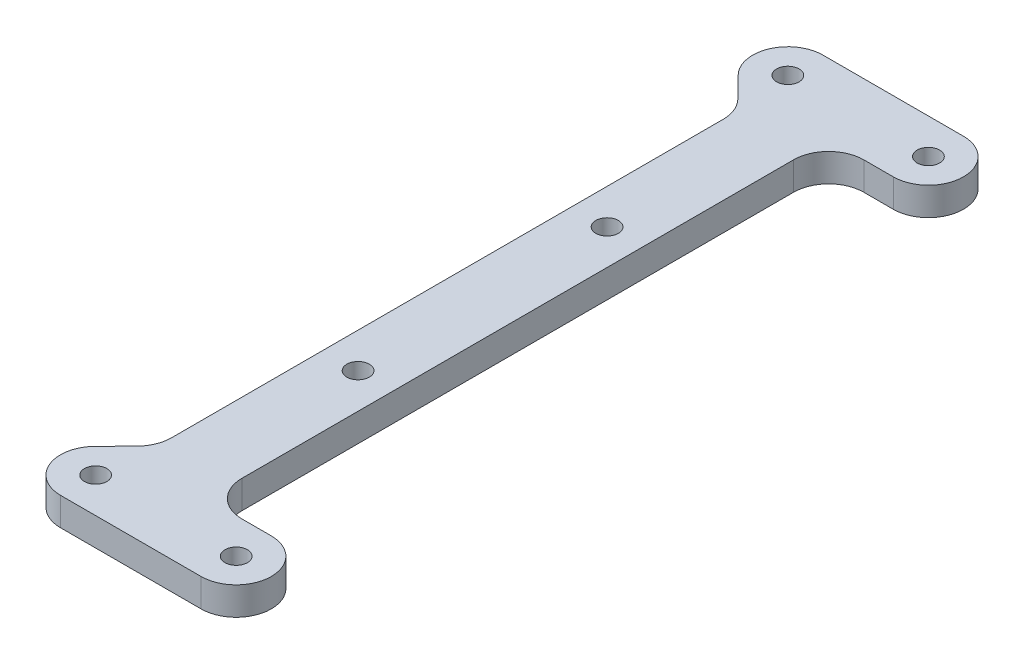
ISO-10303-21;
HEADER;
FILE_DESCRIPTION(('STEP AP214'),'2;1');
FILE_NAME('part.step','',(''),(''),'','','');
FILE_SCHEMA(('AUTOMOTIVE_DESIGN { 1 0 10303 214 1 1 1 1 }'));
ENDSEC;
DATA;
#1=APPLICATION_CONTEXT('core data for automotive mechanical design processes');
#2=APPLICATION_PROTOCOL_DEFINITION('international standard','automotive_design',2000,#1);
#3=PRODUCT_CONTEXT('',#1,'mechanical');
#4=PRODUCT('Part','Part','',(#3));
#5=PRODUCT_RELATED_PRODUCT_CATEGORY('part','',(#4));
#6=PRODUCT_DEFINITION_FORMATION('','',#4);
#7=PRODUCT_DEFINITION_CONTEXT('part definition',#1,'design');
#8=PRODUCT_DEFINITION('design','',#6,#7);
#9=PRODUCT_DEFINITION_SHAPE('','',#8);
#10=(LENGTH_UNIT() NAMED_UNIT(*) SI_UNIT(.MILLI.,.METRE.));
#11=(NAMED_UNIT(*) PLANE_ANGLE_UNIT() SI_UNIT($,.RADIAN.));
#12=(NAMED_UNIT(*) SI_UNIT($,.STERADIAN.) SOLID_ANGLE_UNIT());
#13=UNCERTAINTY_MEASURE_WITH_UNIT(LENGTH_MEASURE(1.E-05),#10,'distance_accuracy_value','');
#14=(GEOMETRIC_REPRESENTATION_CONTEXT(3) GLOBAL_UNCERTAINTY_ASSIGNED_CONTEXT((#13)) GLOBAL_UNIT_ASSIGNED_CONTEXT((#10,
#11,#12)) REPRESENTATION_CONTEXT('',''));
#15=CARTESIAN_POINT('',(0.,0.,0.));
#16=DIRECTION('',(0.,0.,1.));
#17=DIRECTION('',(1.,0.,0.));
#18=AXIS2_PLACEMENT_3D('',#15,#16,#17);
#19=CARTESIAN_POINT('',(5.80999999999996,4.,-39.25));
#20=DIRECTION('',(0.,-1.,0.));
#21=DIRECTION('',(0.,0.,-1.));
#22=AXIS2_PLACEMENT_3D('',#19,#20,#21);
#23=CYLINDRICAL_SURFACE('',#22,5.00000000000001);
#24=CARTESIAN_POINT('',(5.80999999999996,0.,-39.25));
#25=DIRECTION('',(0.,1.,0.));
#26=DIRECTION('',(0.,0.,1.));
#27=AXIS2_PLACEMENT_3D('',#24,#25,#26);
#28=CIRCLE('',#27,5.00000000000001);
#29=CARTESIAN_POINT('',(0.809999999999957,0.,-39.25));
#30=VERTEX_POINT('',#29);
#31=CARTESIAN_POINT('',(5.80999999999996,0.,-44.25));
#32=VERTEX_POINT('',#31);
#33=EDGE_CURVE('E198',#30,#32,#28,.F.);
#34=ORIENTED_EDGE('',*,*,#33,.T.);
#35=DIRECTION('',(0.,-1.,0.));
#36=VECTOR('',#35,1.);
#37=CARTESIAN_POINT('',(5.80999999999996,4.,-44.25));
#38=LINE('',#37,#36);
#39=CARTESIAN_POINT('',(5.80999999999996,4.,-44.25));
#40=VERTEX_POINT('',#39);
#41=EDGE_CURVE('E11',#40,#32,#38,.T.);
#42=ORIENTED_EDGE('',*,*,#41,.F.);
#43=CARTESIAN_POINT('',(5.80999999999996,4.,-39.25));
#44=DIRECTION('',(0.,1.,0.));
#45=DIRECTION('',(0.,0.,1.));
#46=AXIS2_PLACEMENT_3D('',#43,#44,#45);
#47=CIRCLE('',#46,5.00000000000001);
#48=CARTESIAN_POINT('',(0.809999999999957,4.,-39.25));
#49=VERTEX_POINT('',#48);
#50=EDGE_CURVE('E257',#49,#40,#47,.F.);
#51=ORIENTED_EDGE('',*,*,#50,.F.);
#52=DIRECTION('',(0.,-1.,0.));
#53=VECTOR('',#52,1.);
#54=CARTESIAN_POINT('',(0.809999999999957,4.,-39.25));
#55=LINE('',#54,#53);
#56=EDGE_CURVE('E51',#49,#30,#55,.T.);
#57=ORIENTED_EDGE('',*,*,#56,.T.);
#58=EDGE_LOOP('',(#34,#42,#51,#57));
#59=FACE_BOUND('',#58,.T.);
#60=ADVANCED_FACE('F35',(#59),#23,.F.);
#61=CARTESIAN_POINT('',(0.,4.,-44.25));
#62=DIRECTION('',(0.,0.,-1.));
#63=DIRECTION('',(-1.,0.,0.));
#64=AXIS2_PLACEMENT_3D('',#61,#62,#63);
#65=PLANE('',#64);
#66=DIRECTION('',(1.,0.,0.));
#67=VECTOR('',#66,1.);
#68=CARTESIAN_POINT('',(0.,0.,-44.25));
#69=LINE('',#68,#67);
#70=CARTESIAN_POINT('',(9.99999999999996,0.,-44.25));
#71=VERTEX_POINT('',#70);
#72=EDGE_CURVE('E200',#32,#71,#69,.T.);
#73=ORIENTED_EDGE('',*,*,#72,.T.);
#74=DIRECTION('',(0.,-1.,0.));
#75=VECTOR('',#74,1.);
#76=CARTESIAN_POINT('',(9.99999999999996,4.,-44.25));
#77=LINE('',#76,#75);
#78=CARTESIAN_POINT('',(9.99999999999996,4.,-44.25));
#79=VERTEX_POINT('',#78);
#80=EDGE_CURVE('E43',#79,#71,#77,.T.);
#81=ORIENTED_EDGE('',*,*,#80,.F.);
#82=DIRECTION('',(1.,0.,0.));
#83=VECTOR('',#82,1.);
#84=CARTESIAN_POINT('',(0.,4.,-44.25));
#85=LINE('',#84,#83);
#86=EDGE_CURVE('E113',#40,#79,#85,.T.);
#87=ORIENTED_EDGE('',*,*,#86,.F.);
#88=ORIENTED_EDGE('',*,*,#41,.T.);
#89=EDGE_LOOP('',(#73,#81,#87,#88));
#90=FACE_BOUND('',#89,.T.);
#91=ADVANCED_FACE('F343',(#90),#65,.F.);
#92=CARTESIAN_POINT('',(10.,4.,-49.25));
#93=DIRECTION('',(0.,-1.,0.));
#94=DIRECTION('',(0.,0.,-1.));
#95=AXIS2_PLACEMENT_3D('',#92,#93,#94);
#96=CYLINDRICAL_SURFACE('',#95,5.);
#97=CARTESIAN_POINT('',(10.,0.,-49.25));
#98=DIRECTION('',(0.,1.,0.));
#99=DIRECTION('',(0.,0.,1.));
#100=AXIS2_PLACEMENT_3D('',#97,#98,#99);
#101=CIRCLE('',#100,5.);
#102=CARTESIAN_POINT('',(9.99999999999999,0.,-54.25));
#103=VERTEX_POINT('',#102);
#104=EDGE_CURVE('E202',#71,#103,#101,.T.);
#105=ORIENTED_EDGE('',*,*,#104,.T.);
#106=DIRECTION('',(0.,-1.,0.));
#107=VECTOR('',#106,1.);
#108=CARTESIAN_POINT('',(9.99999999999999,4.,-54.25));
#109=LINE('',#108,#107);
#110=CARTESIAN_POINT('',(9.99999999999999,4.,-54.25));
#111=VERTEX_POINT('',#110);
#112=EDGE_CURVE('E281',#111,#103,#109,.T.);
#113=ORIENTED_EDGE('',*,*,#112,.F.);
#114=CARTESIAN_POINT('',(10.,4.,-49.25));
#115=DIRECTION('',(0.,1.,0.));
#116=DIRECTION('',(0.,0.,1.));
#117=AXIS2_PLACEMENT_3D('',#114,#115,#116);
#118=CIRCLE('',#117,5.);
#119=EDGE_CURVE('E288',#79,#111,#118,.T.);
#120=ORIENTED_EDGE('',*,*,#119,.F.);
#121=ORIENTED_EDGE('',*,*,#80,.T.);
#122=EDGE_LOOP('',(#105,#113,#120,#121));
#123=FACE_BOUND('',#122,.T.);
#124=ADVANCED_FACE('F286',(#123),#96,.T.);
#125=CARTESIAN_POINT('',(0.,4.,-54.25));
#126=DIRECTION('',(0.,0.,-1.));
#127=DIRECTION('',(-1.,0.,0.));
#128=AXIS2_PLACEMENT_3D('',#125,#126,#127);
#129=PLANE('',#128);
#130=DIRECTION('',(1.,0.,0.));
#131=VECTOR('',#130,1.);
#132=CARTESIAN_POINT('',(0.,0.,-54.25));
#133=LINE('',#132,#131);
#134=CARTESIAN_POINT('',(-9.99999999999999,0.,-54.25));
#135=VERTEX_POINT('',#134);
#136=EDGE_CURVE('E205',#135,#103,#133,.T.);
#137=ORIENTED_EDGE('',*,*,#136,.F.);
#138=DIRECTION('',(0.,-1.,0.));
#139=VECTOR('',#138,1.);
#140=CARTESIAN_POINT('',(-9.99999999999999,4.,-54.25));
#141=LINE('',#140,#139);
#142=CARTESIAN_POINT('',(-9.99999999999999,4.,-54.25));
#143=VERTEX_POINT('',#142);
#144=EDGE_CURVE('E279',#143,#135,#141,.T.);
#145=ORIENTED_EDGE('',*,*,#144,.F.);
#146=DIRECTION('',(1.,0.,0.));
#147=VECTOR('',#146,1.);
#148=CARTESIAN_POINT('',(0.,4.,-54.25));
#149=LINE('',#148,#147);
#150=EDGE_CURVE('E299',#143,#111,#149,.T.);
#151=ORIENTED_EDGE('',*,*,#150,.T.);
#152=ORIENTED_EDGE('',*,*,#112,.T.);
#153=EDGE_LOOP('',(#137,#145,#151,#152));
#154=FACE_BOUND('',#153,.T.);
#155=ADVANCED_FACE('F295',(#154),#129,.T.);
#156=CARTESIAN_POINT('',(-9.99999999999998,4.,-49.25));
#157=DIRECTION('',(0.,-1.,0.));
#158=DIRECTION('',(0.,0.,-1.));
#159=AXIS2_PLACEMENT_3D('',#156,#157,#158);
#160=CYLINDRICAL_SURFACE('',#159,5.);
#161=CARTESIAN_POINT('',(-9.99999999999998,0.,-49.25));
#162=DIRECTION('',(0.,1.,0.));
#163=DIRECTION('',(0.,0.,1.));
#164=AXIS2_PLACEMENT_3D('',#161,#162,#163);
#165=CIRCLE('',#164,5.);
#166=CARTESIAN_POINT('',(-13.5642557042978,0.,-45.7434231401008));
#167=VERTEX_POINT('',#166);
#168=EDGE_CURVE('E208',#135,#167,#165,.T.);
#169=ORIENTED_EDGE('',*,*,#168,.T.);
#170=DIRECTION('',(0.,-1.,0.));
#171=VECTOR('',#170,1.);
#172=CARTESIAN_POINT('',(-13.5642557042978,4.,-45.7434231401008));
#173=LINE('',#172,#171);
#174=CARTESIAN_POINT('',(-13.5642557042978,4.,-45.7434231401008));
#175=VERTEX_POINT('',#174);
#176=EDGE_CURVE('E277',#175,#167,#173,.T.);
#177=ORIENTED_EDGE('',*,*,#176,.F.);
#178=CARTESIAN_POINT('',(-9.99999999999998,4.,-49.25));
#179=DIRECTION('',(0.,1.,0.));
#180=DIRECTION('',(0.,0.,1.));
#181=AXIS2_PLACEMENT_3D('',#178,#179,#180);
#182=CIRCLE('',#181,5.);
#183=EDGE_CURVE('E300',#143,#175,#182,.T.);
#184=ORIENTED_EDGE('',*,*,#183,.F.);
#185=ORIENTED_EDGE('',*,*,#144,.T.);
#186=EDGE_LOOP('',(#169,#177,#184,#185));
#187=FACE_BOUND('',#186,.T.);
#188=ADVANCED_FACE('F356',(#187),#160,.T.);
#189=CARTESIAN_POINT('',(15.9758998590997,4.,-15.7173686204488));
#190=DIRECTION('',(-0.712851140859559,0.,0.701315371979843));
#191=DIRECTION('',(0.701315371979843,0.,0.712851140859559));
#192=AXIS2_PLACEMENT_3D('',#189,#190,#191);
#193=PLANE('',#192);
#194=DIRECTION('',(-0.701315371979843,0.,-0.712851140859559));
#195=VECTOR('',#194,1.);
#196=CARTESIAN_POINT('',(15.9758998590997,0.,-15.7173686204488));
#197=LINE('',#196,#195);
#198=CARTESIAN_POINT('',(-10.6257442957022,0.,-42.7565768598992));
#199=VERTEX_POINT('',#198);
#200=EDGE_CURVE('E211',#199,#167,#197,.T.);
#201=ORIENTED_EDGE('',*,*,#200,.F.);
#202=DIRECTION('',(0.,-1.,0.));
#203=VECTOR('',#202,1.);
#204=CARTESIAN_POINT('',(-10.6257442957022,4.,-42.7565768598992));
#205=LINE('',#204,#203);
#206=CARTESIAN_POINT('',(-10.6257442957022,4.,-42.7565768598992));
#207=VERTEX_POINT('',#206);
#208=EDGE_CURVE('E275',#207,#199,#205,.T.);
#209=ORIENTED_EDGE('',*,*,#208,.F.);
#210=DIRECTION('',(-0.701315371979843,0.,-0.712851140859559));
#211=VECTOR('',#210,1.);
#212=CARTESIAN_POINT('',(15.9758998590997,4.,-15.7173686204488));
#213=LINE('',#212,#211);
#214=EDGE_CURVE('E302',#207,#175,#213,.T.);
#215=ORIENTED_EDGE('',*,*,#214,.T.);
#216=ORIENTED_EDGE('',*,*,#176,.T.);
#217=EDGE_LOOP('',(#201,#209,#215,#216));
#218=FACE_BOUND('',#217,.T.);
#219=ADVANCED_FACE('F359',(#218),#193,.T.);
#220=CARTESIAN_POINT('',(-14.19,4.,-39.25));
#221=DIRECTION('',(0.,-1.,0.));
#222=DIRECTION('',(0.,0.,-1.));
#223=AXIS2_PLACEMENT_3D('',#220,#221,#222);
#224=CYLINDRICAL_SURFACE('',#223,5.);
#225=CARTESIAN_POINT('',(-14.19,0.,-39.25));
#226=DIRECTION('',(0.,1.,0.));
#227=DIRECTION('',(0.,0.,1.));
#228=AXIS2_PLACEMENT_3D('',#225,#226,#227);
#229=CIRCLE('',#228,5.);
#230=CARTESIAN_POINT('',(-9.19000000000002,0.,-39.25));
#231=VERTEX_POINT('',#230);
#232=EDGE_CURVE('E214',#231,#199,#229,.T.);
#233=ORIENTED_EDGE('',*,*,#232,.F.);
#234=DIRECTION('',(0.,-1.,0.));
#235=VECTOR('',#234,1.);
#236=CARTESIAN_POINT('',(-9.19000000000002,4.,-39.25));
#237=LINE('',#236,#235);
#238=CARTESIAN_POINT('',(-9.19000000000002,4.,-39.25));
#239=VERTEX_POINT('',#238);
#240=EDGE_CURVE('E273',#239,#231,#237,.T.);
#241=ORIENTED_EDGE('',*,*,#240,.F.);
#242=CARTESIAN_POINT('',(-14.19,4.,-39.25));
#243=DIRECTION('',(0.,1.,0.));
#244=DIRECTION('',(0.,0.,1.));
#245=AXIS2_PLACEMENT_3D('',#242,#243,#244);
#246=CIRCLE('',#245,5.);
#247=EDGE_CURVE('E309',#239,#207,#246,.T.);
#248=ORIENTED_EDGE('',*,*,#247,.T.);
#249=ORIENTED_EDGE('',*,*,#208,.T.);
#250=EDGE_LOOP('',(#233,#241,#248,#249));
#251=FACE_BOUND('',#250,.T.);
#252=ADVANCED_FACE('F363',(#251),#224,.F.);
#253=CARTESIAN_POINT('',(-9.19000000000002,4.,0.));
#254=DIRECTION('',(1.,0.,0.));
#255=DIRECTION('',(0.,0.,-1.));
#256=AXIS2_PLACEMENT_3D('',#253,#254,#255);
#257=PLANE('',#256);
#258=DIRECTION('',(0.,0.,1.));
#259=VECTOR('',#258,1.);
#260=CARTESIAN_POINT('',(-9.19000000000002,0.,0.));
#261=LINE('',#260,#259);
#262=CARTESIAN_POINT('',(-9.19000000000002,0.,39.25));
#263=VERTEX_POINT('',#262);
#264=EDGE_CURVE('E217',#231,#263,#261,.T.);
#265=ORIENTED_EDGE('',*,*,#264,.T.);
#266=DIRECTION('',(0.,-1.,0.));
#267=VECTOR('',#266,1.);
#268=CARTESIAN_POINT('',(-9.19000000000002,4.,39.25));
#269=LINE('',#268,#267);
#270=CARTESIAN_POINT('',(-9.19000000000002,4.,39.25));
#271=VERTEX_POINT('',#270);
#272=EDGE_CURVE('E270',#271,#263,#269,.T.);
#273=ORIENTED_EDGE('',*,*,#272,.F.);
#274=DIRECTION('',(0.,0.,1.));
#275=VECTOR('',#274,1.);
#276=CARTESIAN_POINT('',(-9.19000000000002,4.,0.));
#277=LINE('',#276,#275);
#278=EDGE_CURVE('E312',#239,#271,#277,.T.);
#279=ORIENTED_EDGE('',*,*,#278,.F.);
#280=ORIENTED_EDGE('',*,*,#240,.T.);
#281=EDGE_LOOP('',(#265,#273,#279,#280));
#282=FACE_BOUND('',#281,.T.);
#283=ADVANCED_FACE('F367',(#282),#257,.F.);
#284=CARTESIAN_POINT('',(-14.19,4.,39.25));
#285=DIRECTION('',(0.,-1.,0.));
#286=DIRECTION('',(0.,0.,-1.));
#287=AXIS2_PLACEMENT_3D('',#284,#285,#286);
#288=CYLINDRICAL_SURFACE('',#287,5.);
#289=CARTESIAN_POINT('',(-14.19,0.,39.25));
#290=DIRECTION('',(0.,1.,0.));
#291=DIRECTION('',(0.,0.,1.));
#292=AXIS2_PLACEMENT_3D('',#289,#290,#291);
#293=CIRCLE('',#292,5.);
#294=CARTESIAN_POINT('',(-10.6257442957022,0.,42.7565768598992));
#295=VERTEX_POINT('',#294);
#296=EDGE_CURVE('E219',#263,#295,#293,.F.);
#297=ORIENTED_EDGE('',*,*,#296,.T.);
#298=DIRECTION('',(0.,-1.,0.));
#299=VECTOR('',#298,1.);
#300=CARTESIAN_POINT('',(-10.6257442957022,4.,42.7565768598992));
#301=LINE('',#300,#299);
#302=CARTESIAN_POINT('',(-10.6257442957022,4.,42.7565768598992));
#303=VERTEX_POINT('',#302);
#304=EDGE_CURVE('E267',#303,#295,#301,.T.);
#305=ORIENTED_EDGE('',*,*,#304,.F.);
#306=CARTESIAN_POINT('',(-14.19,4.,39.25));
#307=DIRECTION('',(0.,1.,0.));
#308=DIRECTION('',(0.,0.,1.));
#309=AXIS2_PLACEMENT_3D('',#306,#307,#308);
#310=CIRCLE('',#309,5.);
#311=EDGE_CURVE('E314',#271,#303,#310,.F.);
#312=ORIENTED_EDGE('',*,*,#311,.F.);
#313=ORIENTED_EDGE('',*,*,#272,.T.);
#314=EDGE_LOOP('',(#297,#305,#312,#313));
#315=FACE_BOUND('',#314,.T.);
#316=ADVANCED_FACE('F371',(#315),#288,.F.);
#317=CARTESIAN_POINT('',(15.9758998590997,4.,15.7173686204489));
#318=DIRECTION('',(0.712851140859558,0.,0.701315371979844));
#319=DIRECTION('',(0.701315371979844,0.,-0.712851140859558));
#320=AXIS2_PLACEMENT_3D('',#317,#318,#319);
#321=PLANE('',#320);
#322=DIRECTION('',(-0.701315371979844,0.,0.712851140859558));
#323=VECTOR('',#322,1.);
#324=CARTESIAN_POINT('',(15.9758998590997,0.,15.7173686204489));
#325=LINE('',#324,#323);
#326=CARTESIAN_POINT('',(-13.5642557042978,0.,45.7434231401008));
#327=VERTEX_POINT('',#326);
#328=EDGE_CURVE('E221',#295,#327,#325,.T.);
#329=ORIENTED_EDGE('',*,*,#328,.T.);
#330=DIRECTION('',(0.,-1.,0.));
#331=VECTOR('',#330,1.);
#332=CARTESIAN_POINT('',(-13.5642557042978,4.,45.7434231401008));
#333=LINE('',#332,#331);
#334=CARTESIAN_POINT('',(-13.5642557042978,4.,45.7434231401008));
#335=VERTEX_POINT('',#334);
#336=EDGE_CURVE('E265',#335,#327,#333,.T.);
#337=ORIENTED_EDGE('',*,*,#336,.F.);
#338=DIRECTION('',(-0.701315371979844,0.,0.712851140859558));
#339=VECTOR('',#338,1.);
#340=CARTESIAN_POINT('',(15.9758998590997,4.,15.7173686204489));
#341=LINE('',#340,#339);
#342=EDGE_CURVE('E316',#303,#335,#341,.T.);
#343=ORIENTED_EDGE('',*,*,#342,.F.);
#344=ORIENTED_EDGE('',*,*,#304,.T.);
#345=EDGE_LOOP('',(#329,#337,#343,#344));
#346=FACE_BOUND('',#345,.T.);
#347=ADVANCED_FACE('F375',(#346),#321,.F.);
#348=CARTESIAN_POINT('',(-9.99999999999998,4.,49.25));
#349=DIRECTION('',(0.,-1.,0.));
#350=DIRECTION('',(0.,0.,-1.));
#351=AXIS2_PLACEMENT_3D('',#348,#349,#350);
#352=CYLINDRICAL_SURFACE('',#351,5.);
#353=CARTESIAN_POINT('',(-9.99999999999998,0.,49.25));
#354=DIRECTION('',(0.,1.,0.));
#355=DIRECTION('',(0.,0.,1.));
#356=AXIS2_PLACEMENT_3D('',#353,#354,#355);
#357=CIRCLE('',#356,5.);
#358=CARTESIAN_POINT('',(-9.99999999999996,0.,54.25));
#359=VERTEX_POINT('',#358);
#360=EDGE_CURVE('E224',#359,#327,#357,.F.);
#361=ORIENTED_EDGE('',*,*,#360,.F.);
#362=DIRECTION('',(0.,-1.,0.));
#363=VECTOR('',#362,1.);
#364=CARTESIAN_POINT('',(-9.99999999999996,4.,54.25));
#365=LINE('',#364,#363);
#366=CARTESIAN_POINT('',(-9.99999999999996,4.,54.25));
#367=VERTEX_POINT('',#366);
#368=EDGE_CURVE('E263',#367,#359,#365,.T.);
#369=ORIENTED_EDGE('',*,*,#368,.F.);
#370=CARTESIAN_POINT('',(-9.99999999999998,4.,49.25));
#371=DIRECTION('',(0.,1.,0.));
#372=DIRECTION('',(0.,0.,1.));
#373=AXIS2_PLACEMENT_3D('',#370,#371,#372);
#374=CIRCLE('',#373,5.);
#375=EDGE_CURVE('E318',#367,#335,#374,.F.);
#376=ORIENTED_EDGE('',*,*,#375,.T.);
#377=ORIENTED_EDGE('',*,*,#336,.T.);
#378=EDGE_LOOP('',(#361,#369,#376,#377));
#379=FACE_BOUND('',#378,.T.);
#380=ADVANCED_FACE('F379',(#379),#352,.T.);
#381=CARTESIAN_POINT('',(0.,4.,54.25));
#382=DIRECTION('',(0.,0.,-1.));
#383=DIRECTION('',(-1.,0.,0.));
#384=AXIS2_PLACEMENT_3D('',#381,#382,#383);
#385=PLANE('',#384);
#386=DIRECTION('',(1.,0.,0.));
#387=VECTOR('',#386,1.);
#388=CARTESIAN_POINT('',(0.,0.,54.25));
#389=LINE('',#388,#387);
#390=CARTESIAN_POINT('',(9.99999999999999,0.,54.25));
#391=VERTEX_POINT('',#390);
#392=EDGE_CURVE('E227',#359,#391,#389,.T.);
#393=ORIENTED_EDGE('',*,*,#392,.T.);
#394=DIRECTION('',(0.,-1.,0.));
#395=VECTOR('',#394,1.);
#396=CARTESIAN_POINT('',(9.99999999999999,4.,54.25));
#397=LINE('',#396,#395);
#398=CARTESIAN_POINT('',(9.99999999999999,4.,54.25));
#399=VERTEX_POINT('',#398);
#400=EDGE_CURVE('E261',#399,#391,#397,.T.);
#401=ORIENTED_EDGE('',*,*,#400,.F.);
#402=DIRECTION('',(1.,0.,0.));
#403=VECTOR('',#402,1.);
#404=CARTESIAN_POINT('',(0.,4.,54.25));
#405=LINE('',#404,#403);
#406=EDGE_CURVE('E321',#367,#399,#405,.T.);
#407=ORIENTED_EDGE('',*,*,#406,.F.);
#408=ORIENTED_EDGE('',*,*,#368,.T.);
#409=EDGE_LOOP('',(#393,#401,#407,#408));
#410=FACE_BOUND('',#409,.T.);
#411=ADVANCED_FACE('F383',(#410),#385,.F.);
#412=CARTESIAN_POINT('',(10.,4.,49.25));
#413=DIRECTION('',(0.,-1.,0.));
#414=DIRECTION('',(0.,0.,-1.));
#415=AXIS2_PLACEMENT_3D('',#412,#413,#414);
#416=CYLINDRICAL_SURFACE('',#415,5.);
#417=CARTESIAN_POINT('',(10.,0.,49.25));
#418=DIRECTION('',(0.,1.,0.));
#419=DIRECTION('',(0.,0.,1.));
#420=AXIS2_PLACEMENT_3D('',#417,#418,#419);
#421=CIRCLE('',#420,5.);
#422=CARTESIAN_POINT('',(9.99999999999998,0.,44.25));
#423=VERTEX_POINT('',#422);
#424=EDGE_CURVE('E230',#423,#391,#421,.F.);
#425=ORIENTED_EDGE('',*,*,#424,.F.);
#426=DIRECTION('',(0.,-1.,0.));
#427=VECTOR('',#426,1.);
#428=CARTESIAN_POINT('',(9.99999999999998,4.,44.25));
#429=LINE('',#428,#427);
#430=CARTESIAN_POINT('',(9.99999999999998,4.,44.25));
#431=VERTEX_POINT('',#430);
#432=EDGE_CURVE('E162',#431,#423,#429,.T.);
#433=ORIENTED_EDGE('',*,*,#432,.F.);
#434=CARTESIAN_POINT('',(10.,4.,49.25));
#435=DIRECTION('',(0.,1.,0.));
#436=DIRECTION('',(0.,0.,1.));
#437=AXIS2_PLACEMENT_3D('',#434,#435,#436);
#438=CIRCLE('',#437,5.);
#439=EDGE_CURVE('E172',#431,#399,#438,.F.);
#440=ORIENTED_EDGE('',*,*,#439,.T.);
#441=ORIENTED_EDGE('',*,*,#400,.T.);
#442=EDGE_LOOP('',(#425,#433,#440,#441));
#443=FACE_BOUND('',#442,.T.);
#444=ADVANCED_FACE('F324',(#443),#416,.T.);
#445=CARTESIAN_POINT('',(0.,4.,44.25));
#446=DIRECTION('',(0.,0.,-1.));
#447=DIRECTION('',(-1.,0.,0.));
#448=AXIS2_PLACEMENT_3D('',#445,#446,#447);
#449=PLANE('',#448);
#450=DIRECTION('',(1.,0.,0.));
#451=VECTOR('',#450,1.);
#452=CARTESIAN_POINT('',(0.,0.,44.25));
#453=LINE('',#452,#451);
#454=CARTESIAN_POINT('',(5.80999999999997,0.,44.25));
#455=VERTEX_POINT('',#454);
#456=EDGE_CURVE('E158',#455,#423,#453,.T.);
#457=ORIENTED_EDGE('',*,*,#456,.F.);
#458=DIRECTION('',(0.,-1.,0.));
#459=VECTOR('',#458,1.);
#460=CARTESIAN_POINT('',(5.80999999999997,4.,44.25));
#461=LINE('',#460,#459);
#462=CARTESIAN_POINT('',(5.80999999999997,4.,44.25));
#463=VERTEX_POINT('',#462);
#464=EDGE_CURVE('E153',#463,#455,#461,.T.);
#465=ORIENTED_EDGE('',*,*,#464,.F.);
#466=DIRECTION('',(1.,0.,0.));
#467=VECTOR('',#466,1.);
#468=CARTESIAN_POINT('',(0.,4.,44.25));
#469=LINE('',#468,#467);
#470=EDGE_CURVE('E156',#463,#431,#469,.T.);
#471=ORIENTED_EDGE('',*,*,#470,.T.);
#472=ORIENTED_EDGE('',*,*,#432,.T.);
#473=EDGE_LOOP('',(#457,#465,#471,#472));
#474=FACE_BOUND('',#473,.T.);
#475=ADVANCED_FACE('F155',(#474),#449,.T.);
#476=CARTESIAN_POINT('',(5.80999999999996,4.,39.25));
#477=DIRECTION('',(0.,-1.,0.));
#478=DIRECTION('',(0.,0.,-1.));
#479=AXIS2_PLACEMENT_3D('',#476,#477,#478);
#480=CYLINDRICAL_SURFACE('',#479,5.00000000000001);
#481=CARTESIAN_POINT('',(5.80999999999996,0.,39.25));
#482=DIRECTION('',(0.,1.,0.));
#483=DIRECTION('',(0.,0.,1.));
#484=AXIS2_PLACEMENT_3D('',#481,#482,#483);
#485=CIRCLE('',#484,5.00000000000001);
#486=CARTESIAN_POINT('',(0.809999999999957,0.,39.25));
#487=VERTEX_POINT('',#486);
#488=EDGE_CURVE('E234',#487,#455,#485,.T.);
#489=ORIENTED_EDGE('',*,*,#488,.F.);
#490=DIRECTION('',(0.,-1.,0.));
#491=VECTOR('',#490,1.);
#492=CARTESIAN_POINT('',(0.809999999999957,4.,39.25));
#493=LINE('',#492,#491);
#494=CARTESIAN_POINT('',(0.809999999999957,4.,39.25));
#495=VERTEX_POINT('',#494);
#496=EDGE_CURVE('E101',#495,#487,#493,.T.);
#497=ORIENTED_EDGE('',*,*,#496,.F.);
#498=CARTESIAN_POINT('',(5.80999999999996,4.,39.25));
#499=DIRECTION('',(0.,1.,0.));
#500=DIRECTION('',(0.,0.,1.));
#501=AXIS2_PLACEMENT_3D('',#498,#499,#500);
#502=CIRCLE('',#501,5.00000000000001);
#503=EDGE_CURVE('E170',#495,#463,#502,.T.);
#504=ORIENTED_EDGE('',*,*,#503,.T.);
#505=ORIENTED_EDGE('',*,*,#464,.T.);
#506=EDGE_LOOP('',(#489,#497,#504,#505));
#507=FACE_BOUND('',#506,.T.);
#508=ADVANCED_FACE('F174',(#507),#480,.F.);
#509=CARTESIAN_POINT('',(10.,4.,49.25));
#510=DIRECTION('',(0.,-1.,0.));
#511=DIRECTION('',(0.,0.,-1.));
#512=AXIS2_PLACEMENT_3D('',#509,#510,#511);
#513=CYLINDRICAL_SURFACE('',#512,1.6);
#514=CARTESIAN_POINT('',(10.,4.,49.25));
#515=DIRECTION('',(0.,1.,0.));
#516=DIRECTION('',(0.,0.,1.));
#517=AXIS2_PLACEMENT_3D('',#514,#515,#516);
#518=CIRCLE('',#517,1.6);
#519=CARTESIAN_POINT('',(10.,4.,50.85));
#520=VERTEX_POINT('',#519);
#521=EDGE_CURVE('E192',#520,#520,#518,.F.);
#522=ORIENTED_EDGE('',*,*,#521,.F.);
#523=EDGE_LOOP('',(#522));
#524=FACE_BOUND('',#523,.T.);
#525=CARTESIAN_POINT('',(10.,0.,49.25));
#526=DIRECTION('',(0.,1.,0.));
#527=DIRECTION('',(0.,0.,1.));
#528=AXIS2_PLACEMENT_3D('',#525,#526,#527);
#529=CIRCLE('',#528,1.6);
#530=CARTESIAN_POINT('',(10.,0.,50.85));
#531=VERTEX_POINT('',#530);
#532=EDGE_CURVE('E251',#531,#531,#529,.F.);
#533=ORIENTED_EDGE('',*,*,#532,.T.);
#534=EDGE_LOOP('',(#533));
#535=FACE_BOUND('',#534,.T.);
#536=ADVANCED_FACE('F392',(#524,#535),#513,.F.);
#537=CARTESIAN_POINT('',(-4.19000000000004,4.,17.715));
#538=DIRECTION('',(0.,-1.,0.));
#539=DIRECTION('',(0.,0.,-1.));
#540=AXIS2_PLACEMENT_3D('',#537,#538,#539);
#541=CYLINDRICAL_SURFACE('',#540,1.6);
#542=CARTESIAN_POINT('',(-4.19000000000004,4.,17.715));
#543=DIRECTION('',(0.,1.,0.));
#544=DIRECTION('',(0.,0.,1.));
#545=AXIS2_PLACEMENT_3D('',#542,#543,#544);
#546=CIRCLE('',#545,1.6);
#547=CARTESIAN_POINT('',(-4.19000000000004,4.,19.315));
#548=VERTEX_POINT('',#547);
#549=EDGE_CURVE('E189',#548,#548,#546,.F.);
#550=ORIENTED_EDGE('',*,*,#549,.F.);
#551=EDGE_LOOP('',(#550));
#552=FACE_BOUND('',#551,.T.);
#553=CARTESIAN_POINT('',(-4.19000000000004,0.,17.715));
#554=DIRECTION('',(0.,1.,0.));
#555=DIRECTION('',(0.,0.,1.));
#556=AXIS2_PLACEMENT_3D('',#553,#554,#555);
#557=CIRCLE('',#556,1.6);
#558=CARTESIAN_POINT('',(-4.19000000000004,0.,19.315));
#559=VERTEX_POINT('',#558);
#560=EDGE_CURVE('E248',#559,#559,#557,.F.);
#561=ORIENTED_EDGE('',*,*,#560,.T.);
#562=EDGE_LOOP('',(#561));
#563=FACE_BOUND('',#562,.T.);
#564=ADVANCED_FACE('F396',(#552,#563),#541,.F.);
#565=CARTESIAN_POINT('',(-4.19000000000004,4.,-17.715));
#566=DIRECTION('',(0.,-1.,0.));
#567=DIRECTION('',(0.,0.,-1.));
#568=AXIS2_PLACEMENT_3D('',#565,#566,#567);
#569=CYLINDRICAL_SURFACE('',#568,1.6);
#570=CARTESIAN_POINT('',(-4.19000000000004,4.,-17.715));
#571=DIRECTION('',(0.,1.,0.));
#572=DIRECTION('',(0.,0.,1.));
#573=AXIS2_PLACEMENT_3D('',#570,#571,#572);
#574=CIRCLE('',#573,1.6);
#575=CARTESIAN_POINT('',(-4.19000000000004,4.,-16.115));
#576=VERTEX_POINT('',#575);
#577=EDGE_CURVE('E186',#576,#576,#574,.T.);
#578=ORIENTED_EDGE('',*,*,#577,.T.);
#579=EDGE_LOOP('',(#578));
#580=FACE_BOUND('',#579,.T.);
#581=CARTESIAN_POINT('',(-4.19000000000004,0.,-17.715));
#582=DIRECTION('',(0.,1.,0.));
#583=DIRECTION('',(0.,0.,1.));
#584=AXIS2_PLACEMENT_3D('',#581,#582,#583);
#585=CIRCLE('',#584,1.6);
#586=CARTESIAN_POINT('',(-4.19000000000004,0.,-16.115));
#587=VERTEX_POINT('',#586);
#588=EDGE_CURVE('E245',#587,#587,#585,.T.);
#589=ORIENTED_EDGE('',*,*,#588,.F.);
#590=EDGE_LOOP('',(#589));
#591=FACE_BOUND('',#590,.T.);
#592=ADVANCED_FACE('F402',(#580,#591),#569,.F.);
#593=CARTESIAN_POINT('',(-9.99999999999998,4.,-49.25));
#594=DIRECTION('',(0.,-1.,0.));
#595=DIRECTION('',(0.,0.,-1.));
#596=AXIS2_PLACEMENT_3D('',#593,#594,#595);
#597=CYLINDRICAL_SURFACE('',#596,1.6);
#598=CARTESIAN_POINT('',(-9.99999999999998,4.,-49.25));
#599=DIRECTION('',(0.,1.,0.));
#600=DIRECTION('',(0.,0.,1.));
#601=AXIS2_PLACEMENT_3D('',#598,#599,#600);
#602=CIRCLE('',#601,1.6);
#603=CARTESIAN_POINT('',(-9.99999999999998,4.,-47.65));
#604=VERTEX_POINT('',#603);
#605=EDGE_CURVE('E183',#604,#604,#602,.T.);
#606=ORIENTED_EDGE('',*,*,#605,.T.);
#607=EDGE_LOOP('',(#606));
#608=FACE_BOUND('',#607,.T.);
#609=CARTESIAN_POINT('',(-9.99999999999998,0.,-49.25));
#610=DIRECTION('',(0.,1.,0.));
#611=DIRECTION('',(0.,0.,1.));
#612=AXIS2_PLACEMENT_3D('',#609,#610,#611);
#613=CIRCLE('',#612,1.6);
#614=CARTESIAN_POINT('',(-9.99999999999998,0.,-47.65));
#615=VERTEX_POINT('',#614);
#616=EDGE_CURVE('E242',#615,#615,#613,.T.);
#617=ORIENTED_EDGE('',*,*,#616,.F.);
#618=EDGE_LOOP('',(#617));
#619=FACE_BOUND('',#618,.T.);
#620=ADVANCED_FACE('F338',(#608,#619),#597,.F.);
#621=CARTESIAN_POINT('',(10.,4.,-49.25));
#622=DIRECTION('',(0.,-1.,0.));
#623=DIRECTION('',(0.,0.,-1.));
#624=AXIS2_PLACEMENT_3D('',#621,#622,#623);
#625=CYLINDRICAL_SURFACE('',#624,1.6);
#626=CARTESIAN_POINT('',(10.,4.,-49.25));
#627=DIRECTION('',(0.,1.,0.));
#628=DIRECTION('',(0.,0.,1.));
#629=AXIS2_PLACEMENT_3D('',#626,#627,#628);
#630=CIRCLE('',#629,1.6);
#631=CARTESIAN_POINT('',(10.,4.,-47.65));
#632=VERTEX_POINT('',#631);
#633=EDGE_CURVE('E177',#632,#632,#630,.T.);
#634=ORIENTED_EDGE('',*,*,#633,.T.);
#635=EDGE_LOOP('',(#634));
#636=FACE_BOUND('',#635,.T.);
#637=CARTESIAN_POINT('',(10.,0.,-49.25));
#638=DIRECTION('',(0.,1.,0.));
#639=DIRECTION('',(0.,0.,1.));
#640=AXIS2_PLACEMENT_3D('',#637,#638,#639);
#641=CIRCLE('',#640,1.6);
#642=CARTESIAN_POINT('',(10.,0.,-47.65));
#643=VERTEX_POINT('',#642);
#644=EDGE_CURVE('E239',#643,#643,#641,.T.);
#645=ORIENTED_EDGE('',*,*,#644,.F.);
#646=EDGE_LOOP('',(#645));
#647=FACE_BOUND('',#646,.T.);
#648=ADVANCED_FACE('F330',(#636,#647),#625,.F.);
#649=CARTESIAN_POINT('',(0.809999999999957,4.,0.));
#650=DIRECTION('',(1.,0.,0.));
#651=DIRECTION('',(0.,0.,-1.));
#652=AXIS2_PLACEMENT_3D('',#649,#650,#651);
#653=PLANE('',#652);
#654=DIRECTION('',(0.,0.,1.));
#655=VECTOR('',#654,1.);
#656=CARTESIAN_POINT('',(0.809999999999957,0.,0.));
#657=LINE('',#656,#655);
#658=EDGE_CURVE('E236',#30,#487,#657,.T.);
#659=ORIENTED_EDGE('',*,*,#658,.F.);
#660=ORIENTED_EDGE('',*,*,#56,.F.);
#661=DIRECTION('',(0.,0.,1.));
#662=VECTOR('',#661,1.);
#663=CARTESIAN_POINT('',(0.809999999999957,4.,0.));
#664=LINE('',#663,#662);
#665=EDGE_CURVE('E175',#49,#495,#664,.T.);
#666=ORIENTED_EDGE('',*,*,#665,.T.);
#667=ORIENTED_EDGE('',*,*,#496,.T.);
#668=EDGE_LOOP('',(#659,#660,#666,#667));
#669=FACE_BOUND('',#668,.T.);
#670=ADVANCED_FACE('F327',(#669),#653,.T.);
#671=CARTESIAN_POINT('',(-9.99999999999998,4.,49.25));
#672=DIRECTION('',(0.,-1.,0.));
#673=DIRECTION('',(0.,0.,-1.));
#674=AXIS2_PLACEMENT_3D('',#671,#672,#673);
#675=CYLINDRICAL_SURFACE('',#674,1.6);
#676=CARTESIAN_POINT('',(-9.99999999999998,4.,49.25));
#677=DIRECTION('',(0.,1.,0.));
#678=DIRECTION('',(0.,0.,1.));
#679=AXIS2_PLACEMENT_3D('',#676,#677,#678);
#680=CIRCLE('',#679,1.6);
#681=CARTESIAN_POINT('',(-9.99999999999998,4.,50.85));
#682=VERTEX_POINT('',#681);
#683=EDGE_CURVE('E195',#682,#682,#680,.F.);
#684=ORIENTED_EDGE('',*,*,#683,.F.);
#685=EDGE_LOOP('',(#684));
#686=FACE_BOUND('',#685,.T.);
#687=CARTESIAN_POINT('',(-9.99999999999998,0.,49.25));
#688=DIRECTION('',(0.,1.,0.));
#689=DIRECTION('',(0.,0.,1.));
#690=AXIS2_PLACEMENT_3D('',#687,#688,#689);
#691=CIRCLE('',#690,1.6);
#692=CARTESIAN_POINT('',(-9.99999999999998,0.,50.85));
#693=VERTEX_POINT('',#692);
#694=EDGE_CURVE('E254',#693,#693,#691,.F.);
#695=ORIENTED_EDGE('',*,*,#694,.T.);
#696=EDGE_LOOP('',(#695));
#697=FACE_BOUND('',#696,.T.);
#698=ADVANCED_FACE('F329',(#686,#697),#675,.F.);
#699=CARTESIAN_POINT('',(0.,4.,0.));
#700=DIRECTION('',(0.,1.,0.));
#701=DIRECTION('',(0.,0.,1.));
#702=AXIS2_PLACEMENT_3D('',#699,#700,#701);
#703=PLANE('',#702);
#704=ORIENTED_EDGE('',*,*,#50,.T.);
#705=ORIENTED_EDGE('',*,*,#86,.T.);
#706=ORIENTED_EDGE('',*,*,#119,.T.);
#707=ORIENTED_EDGE('',*,*,#150,.F.);
#708=ORIENTED_EDGE('',*,*,#183,.T.);
#709=ORIENTED_EDGE('',*,*,#214,.F.);
#710=ORIENTED_EDGE('',*,*,#247,.F.);
#711=ORIENTED_EDGE('',*,*,#278,.T.);
#712=ORIENTED_EDGE('',*,*,#311,.T.);
#713=ORIENTED_EDGE('',*,*,#342,.T.);
#714=ORIENTED_EDGE('',*,*,#375,.F.);
#715=ORIENTED_EDGE('',*,*,#406,.T.);
#716=ORIENTED_EDGE('',*,*,#439,.F.);
#717=ORIENTED_EDGE('',*,*,#470,.F.);
#718=ORIENTED_EDGE('',*,*,#503,.F.);
#719=ORIENTED_EDGE('',*,*,#665,.F.);
#720=EDGE_LOOP('',(#704,#705,#706,#707,#708,#709,#710,#711,#712,#713,#714,#715,#716,#717,#718,#719));
#721=FACE_BOUND('',#720,.T.);
#722=ORIENTED_EDGE('',*,*,#633,.F.);
#723=EDGE_LOOP('',(#722));
#724=FACE_BOUND('',#723,.T.);
#725=ORIENTED_EDGE('',*,*,#605,.F.);
#726=EDGE_LOOP('',(#725));
#727=FACE_BOUND('',#726,.T.);
#728=ORIENTED_EDGE('',*,*,#577,.F.);
#729=EDGE_LOOP('',(#728));
#730=FACE_BOUND('',#729,.T.);
#731=ORIENTED_EDGE('',*,*,#549,.T.);
#732=EDGE_LOOP('',(#731));
#733=FACE_BOUND('',#732,.T.);
#734=ORIENTED_EDGE('',*,*,#521,.T.);
#735=EDGE_LOOP('',(#734));
#736=FACE_BOUND('',#735,.T.);
#737=ORIENTED_EDGE('',*,*,#683,.T.);
#738=EDGE_LOOP('',(#737));
#739=FACE_BOUND('',#738,.T.);
#740=ADVANCED_FACE('F167',(#721,#724,#727,#730,#733,#736,#739),#703,.T.);
#741=CARTESIAN_POINT('',(0.,0.,0.));
#742=DIRECTION('',(0.,1.,0.));
#743=DIRECTION('',(0.,0.,1.));
#744=AXIS2_PLACEMENT_3D('',#741,#742,#743);
#745=PLANE('',#744);
#746=ORIENTED_EDGE('',*,*,#33,.F.);
#747=ORIENTED_EDGE('',*,*,#658,.T.);
#748=ORIENTED_EDGE('',*,*,#488,.T.);
#749=ORIENTED_EDGE('',*,*,#456,.T.);
#750=ORIENTED_EDGE('',*,*,#424,.T.);
#751=ORIENTED_EDGE('',*,*,#392,.F.);
#752=ORIENTED_EDGE('',*,*,#360,.T.);
#753=ORIENTED_EDGE('',*,*,#328,.F.);
#754=ORIENTED_EDGE('',*,*,#296,.F.);
#755=ORIENTED_EDGE('',*,*,#264,.F.);
#756=ORIENTED_EDGE('',*,*,#232,.T.);
#757=ORIENTED_EDGE('',*,*,#200,.T.);
#758=ORIENTED_EDGE('',*,*,#168,.F.);
#759=ORIENTED_EDGE('',*,*,#136,.T.);
#760=ORIENTED_EDGE('',*,*,#104,.F.);
#761=ORIENTED_EDGE('',*,*,#72,.F.);
#762=EDGE_LOOP('',(#746,#747,#748,#749,#750,#751,#752,#753,#754,#755,#756,#757,#758,#759,#760,#761));
#763=FACE_BOUND('',#762,.T.);
#764=ORIENTED_EDGE('',*,*,#644,.T.);
#765=EDGE_LOOP('',(#764));
#766=FACE_BOUND('',#765,.T.);
#767=ORIENTED_EDGE('',*,*,#616,.T.);
#768=EDGE_LOOP('',(#767));
#769=FACE_BOUND('',#768,.T.);
#770=ORIENTED_EDGE('',*,*,#588,.T.);
#771=EDGE_LOOP('',(#770));
#772=FACE_BOUND('',#771,.T.);
#773=ORIENTED_EDGE('',*,*,#560,.F.);
#774=EDGE_LOOP('',(#773));
#775=FACE_BOUND('',#774,.T.);
#776=ORIENTED_EDGE('',*,*,#532,.F.);
#777=EDGE_LOOP('',(#776));
#778=FACE_BOUND('',#777,.T.);
#779=ORIENTED_EDGE('',*,*,#694,.F.);
#780=EDGE_LOOP('',(#779));
#781=FACE_BOUND('',#780,.T.);
#782=ADVANCED_FACE('F290',(#763,#766,#769,#772,#775,#778,#781),#745,.F.);
#783=CLOSED_SHELL('',(#60,#91,#124,#155,#188,#219,#252,#283,#316,#347,#380,#411,#444,#475,#508,
#536,#564,#592,#620,#648,#670,#698,#740,#782));
#784=MANIFOLD_SOLID_BREP('B2',#783);
#785=ADVANCED_BREP_SHAPE_REPRESENTATION('',(#18,#784),#14);
#786=SHAPE_DEFINITION_REPRESENTATION(#9,#785);
ENDSEC;
END-ISO-10303-21;
